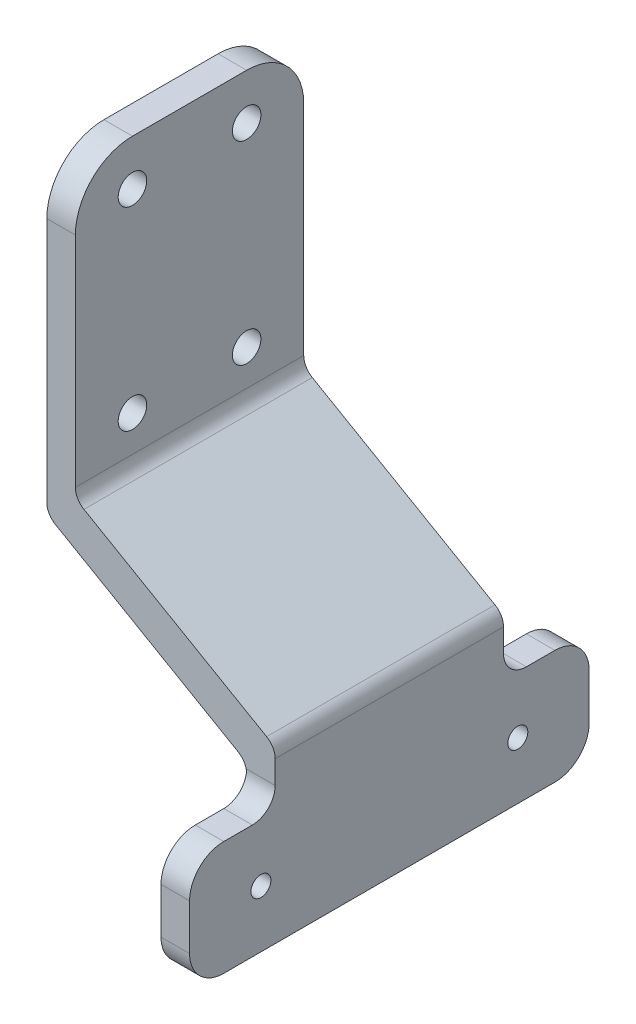
ISO-10303-21;
HEADER;
FILE_DESCRIPTION(('STEP AP214'),'2;1');
FILE_NAME('part.step','',(''),(''),'','','');
FILE_SCHEMA(('AUTOMOTIVE_DESIGN { 1 0 10303 214 1 1 1 1 }'));
ENDSEC;
DATA;
#1=APPLICATION_CONTEXT('core data for automotive mechanical design processes');
#2=APPLICATION_PROTOCOL_DEFINITION('international standard','automotive_design',2000,#1);
#3=PRODUCT_CONTEXT('',#1,'mechanical');
#4=PRODUCT('Part','Part','',(#3));
#5=PRODUCT_RELATED_PRODUCT_CATEGORY('part','',(#4));
#6=PRODUCT_DEFINITION_FORMATION('','',#4);
#7=PRODUCT_DEFINITION_CONTEXT('part definition',#1,'design');
#8=PRODUCT_DEFINITION('design','',#6,#7);
#9=PRODUCT_DEFINITION_SHAPE('','',#8);
#10=(LENGTH_UNIT() NAMED_UNIT(*) SI_UNIT(.MILLI.,.METRE.));
#11=(NAMED_UNIT(*) PLANE_ANGLE_UNIT() SI_UNIT($,.RADIAN.));
#12=(NAMED_UNIT(*) SI_UNIT($,.STERADIAN.) SOLID_ANGLE_UNIT());
#13=UNCERTAINTY_MEASURE_WITH_UNIT(LENGTH_MEASURE(1.E-05),#10,'distance_accuracy_value','');
#14=(GEOMETRIC_REPRESENTATION_CONTEXT(3) GLOBAL_UNCERTAINTY_ASSIGNED_CONTEXT((#13)) GLOBAL_UNIT_ASSIGNED_CONTEXT((#10,
#11,#12)) REPRESENTATION_CONTEXT('',''));
#15=CARTESIAN_POINT('',(0.,0.,0.));
#16=DIRECTION('',(0.,0.,1.));
#17=DIRECTION('',(1.,0.,0.));
#18=AXIS2_PLACEMENT_3D('',#15,#16,#17);
#19=CARTESIAN_POINT('',(0.,0.,20.));
#20=DIRECTION('',(0.,0.,-1.));
#21=DIRECTION('',(-1.,0.,0.));
#22=AXIS2_PLACEMENT_3D('',#19,#20,#21);
#23=PLANE('',#22);
#24=DIRECTION('',(0.,-1.,0.));
#25=VECTOR('',#24,1.);
#26=CARTESIAN_POINT('',(35.,0.,20.));
#27=LINE('',#26,#25);
#28=CARTESIAN_POINT('',(35.,3.0606897707942,20.));
#29=VERTEX_POINT('',#28);
#30=CARTESIAN_POINT('',(35.,-1.,20.));
#31=VERTEX_POINT('',#30);
#32=EDGE_CURVE('E586',#29,#31,#27,.T.);
#33=ORIENTED_EDGE('',*,*,#32,.F.);
#34=CARTESIAN_POINT('',(32.,3.0606897707942,20.));
#35=DIRECTION('',(0.,0.,-1.));
#36=DIRECTION('',(-1.,0.,0.));
#37=AXIS2_PLACEMENT_3D('',#34,#35,#36);
#38=CIRCLE('',#37,3.);
#39=CARTESIAN_POINT('',(33.5,5.65876598214752,20.));
#40=VERTEX_POINT('',#39);
#41=EDGE_CURVE('E383',#29,#40,#38,.F.);
#42=ORIENTED_EDGE('',*,*,#41,.T.);
#43=DIRECTION('',(-0.866025403784438,0.500000000000001,0.));
#44=VECTOR('',#43,1.);
#45=CARTESIAN_POINT('',(35.,4.79274057836308,20.));
#46=LINE('',#45,#44);
#47=CARTESIAN_POINT('',(1.49999999999999,24.1339745962156,20.));
#48=VERTEX_POINT('',#47);
#49=EDGE_CURVE('E341',#40,#48,#46,.T.);
#50=ORIENTED_EDGE('',*,*,#49,.T.);
#51=CARTESIAN_POINT('',(3.,26.7320508075689,20.));
#52=DIRECTION('',(0.,0.,-1.));
#53=DIRECTION('',(-1.,0.,0.));
#54=AXIS2_PLACEMENT_3D('',#51,#52,#53);
#55=CIRCLE('',#54,3.);
#56=CARTESIAN_POINT('',(0.,26.7320508075689,20.));
#57=VERTEX_POINT('',#56);
#58=EDGE_CURVE('E11',#48,#57,#55,.T.);
#59=ORIENTED_EDGE('',*,*,#58,.T.);
#60=DIRECTION('',(0.,1.,0.));
#61=VECTOR('',#60,1.);
#62=CARTESIAN_POINT('',(0.,0.,20.));
#63=LINE('',#62,#61);
#64=CARTESIAN_POINT('',(0.,65.,20.));
#65=VERTEX_POINT('',#64);
#66=EDGE_CURVE('E230',#57,#65,#63,.T.);
#67=ORIENTED_EDGE('',*,*,#66,.T.);
#68=DIRECTION('',(1.,0.,0.));
#69=VECTOR('',#68,1.);
#70=CARTESIAN_POINT('',(-5.,65.,20.));
#71=LINE('',#70,#69);
#72=CARTESIAN_POINT('',(-5.,65.,20.));
#73=VERTEX_POINT('',#72);
#74=EDGE_CURVE('E252',#65,#73,#71,.F.);
#75=ORIENTED_EDGE('',*,*,#74,.T.);
#76=DIRECTION('',(0.,1.,0.));
#77=VECTOR('',#76,1.);
#78=CARTESIAN_POINT('',(-5.,0.,20.));
#79=LINE('',#78,#77);
#80=CARTESIAN_POINT('',(-5.,21.9393102292058,20.));
#81=VERTEX_POINT('',#80);
#82=EDGE_CURVE('E575',#81,#73,#79,.T.);
#83=ORIENTED_EDGE('',*,*,#82,.F.);
#84=CARTESIAN_POINT('',(-2.,21.9393102292058,20.));
#85=DIRECTION('',(0.,0.,-1.));
#86=DIRECTION('',(-1.,0.,0.));
#87=AXIS2_PLACEMENT_3D('',#84,#85,#86);
#88=CIRCLE('',#87,3.);
#89=CARTESIAN_POINT('',(-3.5,19.3412340178525,20.));
#90=VERTEX_POINT('',#89);
#91=EDGE_CURVE('E380',#81,#90,#88,.F.);
#92=ORIENTED_EDGE('',*,*,#91,.T.);
#93=DIRECTION('',(0.866025403784438,-0.500000000000001,0.));
#94=VECTOR('',#93,1.);
#95=CARTESIAN_POINT('',(-5.,20.2072594216369,20.));
#96=LINE('',#95,#94);
#97=CARTESIAN_POINT('',(28.5,0.866025403784429,20.));
#98=VERTEX_POINT('',#97);
#99=EDGE_CURVE('E345',#90,#98,#96,.T.);
#100=ORIENTED_EDGE('',*,*,#99,.T.);
#101=CARTESIAN_POINT('',(27.,-1.73205080756888,20.));
#102=DIRECTION('',(0.,0.,-1.));
#103=DIRECTION('',(-1.,0.,0.));
#104=AXIS2_PLACEMENT_3D('',#101,#102,#103);
#105=CIRCLE('',#104,3.);
#106=CARTESIAN_POINT('',(29.9093129111764,-1.,20.));
#107=VERTEX_POINT('',#106);
#108=EDGE_CURVE('E428',#98,#107,#105,.T.);
#109=ORIENTED_EDGE('',*,*,#108,.T.);
#110=DIRECTION('',(-1.,0.,0.));
#111=VECTOR('',#110,1.);
#112=CARTESIAN_POINT('',(0.,-1.,20.));
#113=LINE('',#112,#111);
#114=EDGE_CURVE('E58',#107,#31,#113,.F.);
#115=ORIENTED_EDGE('',*,*,#114,.T.);
#116=EDGE_LOOP('',(#33,#42,#50,#59,#67,#75,#83,#92,#100,#109,#115));
#117=FACE_BOUND('',#116,.T.);
#118=ADVANCED_FACE('F42',(#117),#23,.F.);
#119=CARTESIAN_POINT('',(0.,0.,-20.));
#120=DIRECTION('',(0.,0.,-1.));
#121=DIRECTION('',(-1.,0.,0.));
#122=AXIS2_PLACEMENT_3D('',#119,#120,#121);
#123=PLANE('',#122);
#124=DIRECTION('',(0.866025403784438,-0.500000000000001,0.));
#125=VECTOR('',#124,1.);
#126=CARTESIAN_POINT('',(10.8253175473055,18.75,-20.));
#127=LINE('',#126,#125);
#128=CARTESIAN_POINT('',(1.5,24.1339745962156,-20.));
#129=VERTEX_POINT('',#128);
#130=CARTESIAN_POINT('',(33.5,5.65876598214752,-20.));
#131=VERTEX_POINT('',#130);
#132=EDGE_CURVE('E349',#129,#131,#127,.T.);
#133=ORIENTED_EDGE('',*,*,#132,.T.);
#134=CARTESIAN_POINT('',(32.,3.0606897707942,-20.));
#135=DIRECTION('',(0.,0.,-1.));
#136=DIRECTION('',(-1.,0.,0.));
#137=AXIS2_PLACEMENT_3D('',#134,#135,#136);
#138=CIRCLE('',#137,3.);
#139=CARTESIAN_POINT('',(35.,3.0606897707942,-20.));
#140=VERTEX_POINT('',#139);
#141=EDGE_CURVE('E389',#131,#140,#138,.T.);
#142=ORIENTED_EDGE('',*,*,#141,.T.);
#143=DIRECTION('',(0.,1.,0.));
#144=VECTOR('',#143,1.);
#145=CARTESIAN_POINT('',(35.,0.,-20.));
#146=LINE('',#145,#144);
#147=CARTESIAN_POINT('',(35.,-1.,-20.));
#148=VERTEX_POINT('',#147);
#149=EDGE_CURVE('E238',#148,#140,#146,.T.);
#150=ORIENTED_EDGE('',*,*,#149,.F.);
#151=DIRECTION('',(-1.,0.,0.));
#152=VECTOR('',#151,1.);
#153=CARTESIAN_POINT('',(30.,-1.,-20.));
#154=LINE('',#153,#152);
#155=CARTESIAN_POINT('',(29.9093129111764,-1.,-20.));
#156=VERTEX_POINT('',#155);
#157=EDGE_CURVE('E66',#148,#156,#154,.T.);
#158=ORIENTED_EDGE('',*,*,#157,.T.);
#159=CARTESIAN_POINT('',(27.,-1.73205080756888,-20.));
#160=DIRECTION('',(0.,0.,-1.));
#161=DIRECTION('',(-1.,0.,0.));
#162=AXIS2_PLACEMENT_3D('',#159,#160,#161);
#163=CIRCLE('',#162,3.);
#164=CARTESIAN_POINT('',(28.5,0.866025403784431,-20.));
#165=VERTEX_POINT('',#164);
#166=EDGE_CURVE('E405',#156,#165,#163,.F.);
#167=ORIENTED_EDGE('',*,*,#166,.T.);
#168=DIRECTION('',(-0.866025403784438,0.500000000000001,0.));
#169=VECTOR('',#168,1.);
#170=CARTESIAN_POINT('',(7.50000000000001,12.9903810567666,-20.));
#171=LINE('',#170,#169);
#172=CARTESIAN_POINT('',(-3.5,19.3412340178525,-20.));
#173=VERTEX_POINT('',#172);
#174=EDGE_CURVE('E353',#165,#173,#171,.T.);
#175=ORIENTED_EDGE('',*,*,#174,.T.);
#176=CARTESIAN_POINT('',(-2.,21.9393102292058,-20.));
#177=DIRECTION('',(0.,0.,-1.));
#178=DIRECTION('',(-1.,0.,0.));
#179=AXIS2_PLACEMENT_3D('',#176,#177,#178);
#180=CIRCLE('',#179,3.);
#181=CARTESIAN_POINT('',(-5.,21.9393102292058,-20.));
#182=VERTEX_POINT('',#181);
#183=EDGE_CURVE('E386',#173,#182,#180,.T.);
#184=ORIENTED_EDGE('',*,*,#183,.T.);
#185=DIRECTION('',(0.,1.,0.));
#186=VECTOR('',#185,1.);
#187=CARTESIAN_POINT('',(-5.,0.,-20.));
#188=LINE('',#187,#186);
#189=CARTESIAN_POINT('',(-5.,65.,-20.));
#190=VERTEX_POINT('',#189);
#191=EDGE_CURVE('E578',#182,#190,#188,.T.);
#192=ORIENTED_EDGE('',*,*,#191,.T.);
#193=DIRECTION('',(1.,0.,0.));
#194=VECTOR('',#193,1.);
#195=CARTESIAN_POINT('',(0.,65.,-20.));
#196=LINE('',#195,#194);
#197=CARTESIAN_POINT('',(0.,65.,-20.));
#198=VERTEX_POINT('',#197);
#199=EDGE_CURVE('E261',#190,#198,#196,.T.);
#200=ORIENTED_EDGE('',*,*,#199,.T.);
#201=DIRECTION('',(0.,1.,0.));
#202=VECTOR('',#201,1.);
#203=CARTESIAN_POINT('',(0.,0.,-20.));
#204=LINE('',#203,#202);
#205=CARTESIAN_POINT('',(0.,26.7320508075689,-20.));
#206=VERTEX_POINT('',#205);
#207=EDGE_CURVE('E213',#206,#198,#204,.T.);
#208=ORIENTED_EDGE('',*,*,#207,.F.);
#209=CARTESIAN_POINT('',(3.,26.7320508075689,-20.));
#210=DIRECTION('',(0.,0.,-1.));
#211=DIRECTION('',(-1.,0.,0.));
#212=AXIS2_PLACEMENT_3D('',#209,#210,#211);
#213=CIRCLE('',#212,3.);
#214=EDGE_CURVE('E51',#206,#129,#213,.F.);
#215=ORIENTED_EDGE('',*,*,#214,.T.);
#216=EDGE_LOOP('',(#133,#142,#150,#158,#167,#175,#184,#192,#200,#208,#215));
#217=FACE_BOUND('',#216,.T.);
#218=ADVANCED_FACE('F456',(#217),#123,.T.);
#219=CARTESIAN_POINT('',(30.,0.,0.));
#220=DIRECTION('',(1.,0.,0.));
#221=DIRECTION('',(0.,0.,-1.));
#222=AXIS2_PLACEMENT_3D('',#219,#220,#221);
#223=PLANE('',#222);
#224=CARTESIAN_POINT('',(30.,-15.,22.5));
#225=DIRECTION('',(1.,0.,0.));
#226=DIRECTION('',(0.,0.,-1.));
#227=AXIS2_PLACEMENT_3D('',#224,#225,#226);
#228=CIRCLE('',#227,1.75);
#229=CARTESIAN_POINT('',(30.,-15.,20.75));
#230=VERTEX_POINT('',#229);
#231=EDGE_CURVE('E231',#230,#230,#228,.T.);
#232=ORIENTED_EDGE('',*,*,#231,.T.);
#233=EDGE_LOOP('',(#232));
#234=FACE_BOUND('',#233,.T.);
#235=CARTESIAN_POINT('',(30.,-15.,-22.5));
#236=DIRECTION('',(1.,0.,0.));
#237=DIRECTION('',(0.,0.,-1.));
#238=AXIS2_PLACEMENT_3D('',#235,#236,#237);
#239=CIRCLE('',#238,1.75);
#240=CARTESIAN_POINT('',(30.,-15.,-24.25));
#241=VERTEX_POINT('',#240);
#242=EDGE_CURVE('E562',#241,#241,#239,.T.);
#243=ORIENTED_EDGE('',*,*,#242,.T.);
#244=EDGE_LOOP('',(#243));
#245=FACE_BOUND('',#244,.T.);
#246=CARTESIAN_POINT('',(30.,-1.,24.));
#247=DIRECTION('',(1.,0.,0.));
#248=DIRECTION('',(0.,0.,-1.));
#249=AXIS2_PLACEMENT_3D('',#246,#247,#248);
#250=CIRCLE('',#249,4.);
#251=CARTESIAN_POINT('',(30.,-5.,24.));
#252=VERTEX_POINT('',#251);
#253=CARTESIAN_POINT('',(30.,-1.73205080756888,20.0675578052389));
#254=VERTEX_POINT('',#253);
#255=EDGE_CURVE('E328',#252,#254,#250,.T.);
#256=ORIENTED_EDGE('',*,*,#255,.T.);
#257=DIRECTION('',(0.,0.,-1.));
#258=VECTOR('',#257,1.);
#259=CARTESIAN_POINT('',(30.,-1.73205080756888,0.));
#260=LINE('',#259,#258);
#261=CARTESIAN_POINT('',(30.,-1.73205080756888,-20.0675578052389));
#262=VERTEX_POINT('',#261);
#263=EDGE_CURVE('E357',#254,#262,#260,.T.);
#264=ORIENTED_EDGE('',*,*,#263,.T.);
#265=CARTESIAN_POINT('',(30.,-1.,-24.));
#266=DIRECTION('',(1.,0.,0.));
#267=DIRECTION('',(0.,0.,-1.));
#268=AXIS2_PLACEMENT_3D('',#265,#266,#267);
#269=CIRCLE('',#268,4.);
#270=CARTESIAN_POINT('',(30.,-5.,-24.));
#271=VERTEX_POINT('',#270);
#272=EDGE_CURVE('E335',#262,#271,#269,.T.);
#273=ORIENTED_EDGE('',*,*,#272,.T.);
#274=DIRECTION('',(0.,0.,-1.));
#275=VECTOR('',#274,1.);
#276=CARTESIAN_POINT('',(30.,-5.,0.));
#277=LINE('',#276,#275);
#278=CARTESIAN_POINT('',(30.,-5.,-29.));
#279=VERTEX_POINT('',#278);
#280=EDGE_CURVE('E590',#271,#279,#277,.T.);
#281=ORIENTED_EDGE('',*,*,#280,.T.);
#282=CARTESIAN_POINT('',(30.,-11.,-29.));
#283=DIRECTION('',(1.,0.,0.));
#284=DIRECTION('',(0.,0.,-1.));
#285=AXIS2_PLACEMENT_3D('',#282,#283,#284);
#286=CIRCLE('',#285,6.);
#287=CARTESIAN_POINT('',(30.,-11.,-35.));
#288=VERTEX_POINT('',#287);
#289=EDGE_CURVE('E277',#279,#288,#286,.F.);
#290=ORIENTED_EDGE('',*,*,#289,.T.);
#291=DIRECTION('',(0.,1.,0.));
#292=VECTOR('',#291,1.);
#293=CARTESIAN_POINT('',(30.,0.,-35.));
#294=LINE('',#293,#292);
#295=CARTESIAN_POINT('',(30.,-19.,-35.));
#296=VERTEX_POINT('',#295);
#297=EDGE_CURVE('E247',#296,#288,#294,.T.);
#298=ORIENTED_EDGE('',*,*,#297,.F.);
#299=CARTESIAN_POINT('',(30.,-19.,-29.));
#300=DIRECTION('',(1.,0.,0.));
#301=DIRECTION('',(0.,0.,-1.));
#302=AXIS2_PLACEMENT_3D('',#299,#300,#301);
#303=CIRCLE('',#302,6.);
#304=CARTESIAN_POINT('',(30.,-25.,-29.));
#305=VERTEX_POINT('',#304);
#306=EDGE_CURVE('E274',#296,#305,#303,.F.);
#307=ORIENTED_EDGE('',*,*,#306,.T.);
#308=DIRECTION('',(0.,0.,-1.));
#309=VECTOR('',#308,1.);
#310=CARTESIAN_POINT('',(30.,-25.,0.));
#311=LINE('',#310,#309);
#312=CARTESIAN_POINT('',(30.,-25.,29.));
#313=VERTEX_POINT('',#312);
#314=EDGE_CURVE('E612',#313,#305,#311,.T.);
#315=ORIENTED_EDGE('',*,*,#314,.F.);
#316=CARTESIAN_POINT('',(30.,-19.,29.));
#317=DIRECTION('',(1.,0.,0.));
#318=DIRECTION('',(0.,0.,-1.));
#319=AXIS2_PLACEMENT_3D('',#316,#317,#318);
#320=CIRCLE('',#319,6.);
#321=CARTESIAN_POINT('',(30.,-19.,35.));
#322=VERTEX_POINT('',#321);
#323=EDGE_CURVE('E271',#313,#322,#320,.F.);
#324=ORIENTED_EDGE('',*,*,#323,.T.);
#325=DIRECTION('',(0.,1.,0.));
#326=VECTOR('',#325,1.);
#327=CARTESIAN_POINT('',(30.,0.,35.));
#328=LINE('',#327,#326);
#329=CARTESIAN_POINT('',(30.,-11.,35.));
#330=VERTEX_POINT('',#329);
#331=EDGE_CURVE('E609',#322,#330,#328,.T.);
#332=ORIENTED_EDGE('',*,*,#331,.T.);
#333=CARTESIAN_POINT('',(30.,-11.,29.));
#334=DIRECTION('',(1.,0.,0.));
#335=DIRECTION('',(0.,0.,-1.));
#336=AXIS2_PLACEMENT_3D('',#333,#334,#335);
#337=CIRCLE('',#336,6.);
#338=CARTESIAN_POINT('',(30.,-5.,29.));
#339=VERTEX_POINT('',#338);
#340=EDGE_CURVE('E268',#330,#339,#337,.F.);
#341=ORIENTED_EDGE('',*,*,#340,.T.);
#342=EDGE_CURVE('E580',#339,#252,#277,.T.);
#343=ORIENTED_EDGE('',*,*,#342,.T.);
#344=EDGE_LOOP('',(#256,#264,#273,#281,#290,#298,#307,#315,#324,#332,#341,#343));
#345=FACE_BOUND('',#344,.T.);
#346=ADVANCED_FACE('F459',(#234,#245,#345),#223,.F.);
#347=CARTESIAN_POINT('',(35.,-5.,0.));
#348=DIRECTION('',(0.,1.,0.));
#349=DIRECTION('',(0.,0.,1.));
#350=AXIS2_PLACEMENT_3D('',#347,#348,#349);
#351=PLANE('',#350);
#352=DIRECTION('',(0.,0.,-1.));
#353=VECTOR('',#352,1.);
#354=CARTESIAN_POINT('',(35.,-5.,0.));
#355=LINE('',#354,#353);
#356=CARTESIAN_POINT('',(35.,-5.,29.));
#357=VERTEX_POINT('',#356);
#358=CARTESIAN_POINT('',(35.,-5.,24.));
#359=VERTEX_POINT('',#358);
#360=EDGE_CURVE('E589',#357,#359,#355,.T.);
#361=ORIENTED_EDGE('',*,*,#360,.T.);
#362=DIRECTION('',(-1.,0.,0.));
#363=VECTOR('',#362,1.);
#364=CARTESIAN_POINT('',(35.,-5.,24.));
#365=LINE('',#364,#363);
#366=EDGE_CURVE('E317',#359,#252,#365,.T.);
#367=ORIENTED_EDGE('',*,*,#366,.T.);
#368=ORIENTED_EDGE('',*,*,#342,.F.);
#369=DIRECTION('',(-1.,0.,0.));
#370=VECTOR('',#369,1.);
#371=CARTESIAN_POINT('',(35.,-5.,29.));
#372=LINE('',#371,#370);
#373=EDGE_CURVE('E314',#339,#357,#372,.F.);
#374=ORIENTED_EDGE('',*,*,#373,.T.);
#375=EDGE_LOOP('',(#361,#367,#368,#374));
#376=FACE_BOUND('',#375,.T.);
#377=ADVANCED_FACE('F467',(#376),#351,.T.);
#378=CARTESIAN_POINT('',(35.,0.,35.));
#379=DIRECTION('',(0.,0.,1.));
#380=DIRECTION('',(0.,-1.,0.));
#381=AXIS2_PLACEMENT_3D('',#378,#379,#380);
#382=PLANE('',#381);
#383=ORIENTED_EDGE('',*,*,#331,.F.);
#384=DIRECTION('',(-1.,0.,0.));
#385=VECTOR('',#384,1.);
#386=CARTESIAN_POINT('',(35.,-19.,35.));
#387=LINE('',#386,#385);
#388=CARTESIAN_POINT('',(35.,-19.,35.));
#389=VERTEX_POINT('',#388);
#390=EDGE_CURVE('E311',#322,#389,#387,.F.);
#391=ORIENTED_EDGE('',*,*,#390,.T.);
#392=DIRECTION('',(0.,1.,0.));
#393=VECTOR('',#392,1.);
#394=CARTESIAN_POINT('',(35.,0.,35.));
#395=LINE('',#394,#393);
#396=CARTESIAN_POINT('',(35.,-11.,35.));
#397=VERTEX_POINT('',#396);
#398=EDGE_CURVE('E594',#389,#397,#395,.T.);
#399=ORIENTED_EDGE('',*,*,#398,.T.);
#400=DIRECTION('',(-1.,0.,0.));
#401=VECTOR('',#400,1.);
#402=CARTESIAN_POINT('',(35.,-11.,35.));
#403=LINE('',#402,#401);
#404=EDGE_CURVE('E307',#397,#330,#403,.T.);
#405=ORIENTED_EDGE('',*,*,#404,.T.);
#406=EDGE_LOOP('',(#383,#391,#399,#405));
#407=FACE_BOUND('',#406,.T.);
#408=ADVANCED_FACE('F463',(#407),#382,.T.);
#409=CARTESIAN_POINT('',(35.,-25.,0.));
#410=DIRECTION('',(0.,1.,0.));
#411=DIRECTION('',(0.,0.,1.));
#412=AXIS2_PLACEMENT_3D('',#409,#410,#411);
#413=PLANE('',#412);
#414=ORIENTED_EDGE('',*,*,#314,.T.);
#415=DIRECTION('',(-1.,0.,0.));
#416=VECTOR('',#415,1.);
#417=CARTESIAN_POINT('',(35.,-25.,-29.));
#418=LINE('',#417,#416);
#419=CARTESIAN_POINT('',(35.,-25.,-29.));
#420=VERTEX_POINT('',#419);
#421=EDGE_CURVE('E304',#305,#420,#418,.F.);
#422=ORIENTED_EDGE('',*,*,#421,.T.);
#423=DIRECTION('',(0.,0.,-1.));
#424=VECTOR('',#423,1.);
#425=CARTESIAN_POINT('',(35.,-25.,0.));
#426=LINE('',#425,#424);
#427=CARTESIAN_POINT('',(35.,-25.,29.));
#428=VERTEX_POINT('',#427);
#429=EDGE_CURVE('E598',#428,#420,#426,.T.);
#430=ORIENTED_EDGE('',*,*,#429,.F.);
#431=DIRECTION('',(-1.,0.,0.));
#432=VECTOR('',#431,1.);
#433=CARTESIAN_POINT('',(30.,-25.,29.));
#434=LINE('',#433,#432);
#435=EDGE_CURVE('E300',#428,#313,#434,.T.);
#436=ORIENTED_EDGE('',*,*,#435,.T.);
#437=EDGE_LOOP('',(#414,#422,#430,#436));
#438=FACE_BOUND('',#437,.T.);
#439=ADVANCED_FACE('F466',(#438),#413,.F.);
#440=CARTESIAN_POINT('',(35.,0.,-35.));
#441=DIRECTION('',(0.,0.,1.));
#442=DIRECTION('',(1.,0.,0.));
#443=AXIS2_PLACEMENT_3D('',#440,#441,#442);
#444=PLANE('',#443);
#445=ORIENTED_EDGE('',*,*,#297,.T.);
#446=DIRECTION('',(-1.,0.,0.));
#447=VECTOR('',#446,1.);
#448=CARTESIAN_POINT('',(35.,-11.,-35.));
#449=LINE('',#448,#447);
#450=CARTESIAN_POINT('',(35.,-11.,-35.));
#451=VERTEX_POINT('',#450);
#452=EDGE_CURVE('E284',#288,#451,#449,.F.);
#453=ORIENTED_EDGE('',*,*,#452,.T.);
#454=DIRECTION('',(0.,1.,0.));
#455=VECTOR('',#454,1.);
#456=CARTESIAN_POINT('',(35.,0.,-35.));
#457=LINE('',#456,#455);
#458=CARTESIAN_POINT('',(35.,-19.,-35.));
#459=VERTEX_POINT('',#458);
#460=EDGE_CURVE('E602',#459,#451,#457,.T.);
#461=ORIENTED_EDGE('',*,*,#460,.F.);
#462=DIRECTION('',(-1.,0.,0.));
#463=VECTOR('',#462,1.);
#464=CARTESIAN_POINT('',(35.,-19.,-35.));
#465=LINE('',#464,#463);
#466=EDGE_CURVE('E280',#459,#296,#465,.T.);
#467=ORIENTED_EDGE('',*,*,#466,.T.);
#468=EDGE_LOOP('',(#445,#453,#461,#467));
#469=FACE_BOUND('',#468,.T.);
#470=ADVANCED_FACE('F471',(#469),#444,.F.);
#471=ORIENTED_EDGE('',*,*,#280,.F.);
#472=DIRECTION('',(-1.,0.,0.));
#473=VECTOR('',#472,1.);
#474=CARTESIAN_POINT('',(35.,-5.,-24.));
#475=LINE('',#474,#473);
#476=CARTESIAN_POINT('',(35.,-5.,-24.));
#477=VERTEX_POINT('',#476);
#478=EDGE_CURVE('E325',#271,#477,#475,.F.);
#479=ORIENTED_EDGE('',*,*,#478,.T.);
#480=CARTESIAN_POINT('',(35.,-5.,-29.));
#481=VERTEX_POINT('',#480);
#482=EDGE_CURVE('E244',#477,#481,#355,.T.);
#483=ORIENTED_EDGE('',*,*,#482,.T.);
#484=DIRECTION('',(-1.,0.,0.));
#485=VECTOR('',#484,1.);
#486=CARTESIAN_POINT('',(30.,-5.,-29.));
#487=LINE('',#486,#485);
#488=EDGE_CURVE('E264',#481,#279,#487,.T.);
#489=ORIENTED_EDGE('',*,*,#488,.T.);
#490=EDGE_LOOP('',(#471,#479,#483,#489));
#491=FACE_BOUND('',#490,.T.);
#492=ADVANCED_FACE('F475',(#491),#351,.T.);
#493=CARTESIAN_POINT('',(35.,0.,0.));
#494=DIRECTION('',(1.,0.,0.));
#495=DIRECTION('',(0.,0.,-1.));
#496=AXIS2_PLACEMENT_3D('',#493,#494,#495);
#497=PLANE('',#496);
#498=CARTESIAN_POINT('',(35.,-15.,22.5));
#499=DIRECTION('',(1.,0.,0.));
#500=DIRECTION('',(0.,0.,-1.));
#501=AXIS2_PLACEMENT_3D('',#498,#499,#500);
#502=CIRCLE('',#501,1.75);
#503=CARTESIAN_POINT('',(35.,-15.,20.75));
#504=VERTEX_POINT('',#503);
#505=EDGE_CURVE('E558',#504,#504,#502,.T.);
#506=ORIENTED_EDGE('',*,*,#505,.F.);
#507=EDGE_LOOP('',(#506));
#508=FACE_BOUND('',#507,.T.);
#509=CARTESIAN_POINT('',(35.,-15.,-22.5));
#510=DIRECTION('',(1.,0.,0.));
#511=DIRECTION('',(0.,0.,-1.));
#512=AXIS2_PLACEMENT_3D('',#509,#510,#511);
#513=CIRCLE('',#512,1.75);
#514=CARTESIAN_POINT('',(35.,-15.,-24.25));
#515=VERTEX_POINT('',#514);
#516=EDGE_CURVE('E554',#515,#515,#513,.T.);
#517=ORIENTED_EDGE('',*,*,#516,.F.);
#518=EDGE_LOOP('',(#517));
#519=FACE_BOUND('',#518,.T.);
#520=ORIENTED_EDGE('',*,*,#149,.T.);
#521=DIRECTION('',(0.,0.,1.));
#522=VECTOR('',#521,1.);
#523=CARTESIAN_POINT('',(35.,3.0606897707942,0.));
#524=LINE('',#523,#522);
#525=EDGE_CURVE('E376',#140,#29,#524,.T.);
#526=ORIENTED_EDGE('',*,*,#525,.T.);
#527=ORIENTED_EDGE('',*,*,#32,.T.);
#528=CARTESIAN_POINT('',(35.,-1.,24.));
#529=DIRECTION('',(1.,0.,0.));
#530=DIRECTION('',(0.,0.,-1.));
#531=AXIS2_PLACEMENT_3D('',#528,#529,#530);
#532=CIRCLE('',#531,4.);
#533=EDGE_CURVE('E332',#31,#359,#532,.F.);
#534=ORIENTED_EDGE('',*,*,#533,.T.);
#535=ORIENTED_EDGE('',*,*,#360,.F.);
#536=CARTESIAN_POINT('',(35.,-11.,29.));
#537=DIRECTION('',(1.,0.,0.));
#538=DIRECTION('',(0.,0.,-1.));
#539=AXIS2_PLACEMENT_3D('',#536,#537,#538);
#540=CIRCLE('',#539,6.);
#541=EDGE_CURVE('E287',#357,#397,#540,.T.);
#542=ORIENTED_EDGE('',*,*,#541,.T.);
#543=ORIENTED_EDGE('',*,*,#398,.F.);
#544=CARTESIAN_POINT('',(35.,-19.,29.));
#545=DIRECTION('',(1.,0.,0.));
#546=DIRECTION('',(0.,0.,-1.));
#547=AXIS2_PLACEMENT_3D('',#544,#545,#546);
#548=CIRCLE('',#547,6.);
#549=EDGE_CURVE('E290',#389,#428,#548,.T.);
#550=ORIENTED_EDGE('',*,*,#549,.T.);
#551=ORIENTED_EDGE('',*,*,#429,.T.);
#552=CARTESIAN_POINT('',(35.,-19.,-29.));
#553=DIRECTION('',(1.,0.,0.));
#554=DIRECTION('',(0.,0.,-1.));
#555=AXIS2_PLACEMENT_3D('',#552,#553,#554);
#556=CIRCLE('',#555,6.);
#557=EDGE_CURVE('E293',#420,#459,#556,.T.);
#558=ORIENTED_EDGE('',*,*,#557,.T.);
#559=ORIENTED_EDGE('',*,*,#460,.T.);
#560=CARTESIAN_POINT('',(35.,-11.,-29.));
#561=DIRECTION('',(1.,0.,0.));
#562=DIRECTION('',(0.,0.,-1.));
#563=AXIS2_PLACEMENT_3D('',#560,#561,#562);
#564=CIRCLE('',#563,6.);
#565=EDGE_CURVE('E296',#451,#481,#564,.T.);
#566=ORIENTED_EDGE('',*,*,#565,.T.);
#567=ORIENTED_EDGE('',*,*,#482,.F.);
#568=CARTESIAN_POINT('',(35.,-1.,-24.));
#569=DIRECTION('',(1.,0.,0.));
#570=DIRECTION('',(0.,0.,-1.));
#571=AXIS2_PLACEMENT_3D('',#568,#569,#570);
#572=CIRCLE('',#571,4.);
#573=EDGE_CURVE('E338',#477,#148,#572,.F.);
#574=ORIENTED_EDGE('',*,*,#573,.T.);
#575=EDGE_LOOP('',(#520,#526,#527,#534,#535,#542,#543,#550,#551,#558,#559,#566,#567,#574));
#576=FACE_BOUND('',#575,.T.);
#577=ADVANCED_FACE('F479',(#508,#519,#576),#497,.T.);
#578=CARTESIAN_POINT('',(0.,0.,0.));
#579=DIRECTION('',(-1.,0.,0.));
#580=DIRECTION('',(0.,0.,1.));
#581=AXIS2_PLACEMENT_3D('',#578,#579,#580);
#582=PLANE('',#581);
#583=CARTESIAN_POINT('',(0.,67.,-10.));
#584=DIRECTION('',(1.,0.,0.));
#585=DIRECTION('',(0.,0.,1.));
#586=AXIS2_PLACEMENT_3D('',#583,#584,#585);
#587=CIRCLE('',#586,2.5);
#588=CARTESIAN_POINT('',(0.,67.,-7.5));
#589=VERTEX_POINT('',#588);
#590=EDGE_CURVE('E546',#589,#589,#587,.T.);
#591=ORIENTED_EDGE('',*,*,#590,.F.);
#592=EDGE_LOOP('',(#591));
#593=FACE_BOUND('',#592,.T.);
#594=CARTESIAN_POINT('',(0.,33.,-10.));
#595=DIRECTION('',(1.,0.,0.));
#596=DIRECTION('',(0.,0.,1.));
#597=AXIS2_PLACEMENT_3D('',#594,#595,#596);
#598=CIRCLE('',#597,2.5);
#599=CARTESIAN_POINT('',(0.,33.,-7.5));
#600=VERTEX_POINT('',#599);
#601=EDGE_CURVE('E536',#600,#600,#598,.T.);
#602=ORIENTED_EDGE('',*,*,#601,.F.);
#603=EDGE_LOOP('',(#602));
#604=FACE_BOUND('',#603,.T.);
#605=CARTESIAN_POINT('',(0.,33.,10.));
#606=DIRECTION('',(1.,0.,0.));
#607=DIRECTION('',(0.,0.,-1.));
#608=AXIS2_PLACEMENT_3D('',#605,#606,#607);
#609=CIRCLE('',#608,2.5);
#610=CARTESIAN_POINT('',(0.,33.,7.5));
#611=VERTEX_POINT('',#610);
#612=EDGE_CURVE('E526',#611,#611,#609,.T.);
#613=ORIENTED_EDGE('',*,*,#612,.F.);
#614=EDGE_LOOP('',(#613));
#615=FACE_BOUND('',#614,.T.);
#616=CARTESIAN_POINT('',(0.,67.,10.));
#617=DIRECTION('',(1.,0.,0.));
#618=DIRECTION('',(0.,0.,-1.));
#619=AXIS2_PLACEMENT_3D('',#616,#617,#618);
#620=CIRCLE('',#619,2.5);
#621=CARTESIAN_POINT('',(0.,67.,7.5));
#622=VERTEX_POINT('',#621);
#623=EDGE_CURVE('E533',#622,#622,#620,.T.);
#624=ORIENTED_EDGE('',*,*,#623,.F.);
#625=EDGE_LOOP('',(#624));
#626=FACE_BOUND('',#625,.T.);
#627=ORIENTED_EDGE('',*,*,#66,.F.);
#628=DIRECTION('',(0.,0.,-1.));
#629=VECTOR('',#628,1.);
#630=CARTESIAN_POINT('',(0.,26.7320508075689,0.));
#631=LINE('',#630,#629);
#632=EDGE_CURVE('E367',#57,#206,#631,.T.);
#633=ORIENTED_EDGE('',*,*,#632,.T.);
#634=ORIENTED_EDGE('',*,*,#207,.T.);
#635=CARTESIAN_POINT('',(0.,65.,-10.));
#636=DIRECTION('',(-1.,0.,0.));
#637=DIRECTION('',(0.,0.,1.));
#638=AXIS2_PLACEMENT_3D('',#635,#636,#637);
#639=CIRCLE('',#638,10.);
#640=CARTESIAN_POINT('',(0.,75.,-10.));
#641=VERTEX_POINT('',#640);
#642=EDGE_CURVE('E205',#198,#641,#639,.F.);
#643=ORIENTED_EDGE('',*,*,#642,.T.);
#644=DIRECTION('',(0.,0.,1.));
#645=VECTOR('',#644,1.);
#646=CARTESIAN_POINT('',(0.,75.,-20.));
#647=LINE('',#646,#645);
#648=CARTESIAN_POINT('',(0.,75.,10.));
#649=VERTEX_POINT('',#648);
#650=EDGE_CURVE('E210',#641,#649,#647,.T.);
#651=ORIENTED_EDGE('',*,*,#650,.T.);
#652=CARTESIAN_POINT('',(0.,65.,10.));
#653=DIRECTION('',(-1.,0.,0.));
#654=DIRECTION('',(0.,0.,1.));
#655=AXIS2_PLACEMENT_3D('',#652,#653,#654);
#656=CIRCLE('',#655,10.);
#657=EDGE_CURVE('E219',#649,#65,#656,.F.);
#658=ORIENTED_EDGE('',*,*,#657,.T.);
#659=EDGE_LOOP('',(#627,#633,#634,#643,#651,#658));
#660=FACE_BOUND('',#659,.T.);
#661=ADVANCED_FACE('F208',(#593,#604,#615,#626,#660),#582,.F.);
#662=CARTESIAN_POINT('',(-5.,75.,-20.));
#663=DIRECTION('',(0.,1.,0.));
#664=DIRECTION('',(0.,0.,1.));
#665=AXIS2_PLACEMENT_3D('',#662,#663,#664);
#666=PLANE('',#665);
#667=DIRECTION('',(0.,0.,1.));
#668=VECTOR('',#667,1.);
#669=CARTESIAN_POINT('',(-5.,75.,-20.));
#670=LINE('',#669,#668);
#671=CARTESIAN_POINT('',(-5.,75.,-10.));
#672=VERTEX_POINT('',#671);
#673=CARTESIAN_POINT('',(-5.,75.,10.));
#674=VERTEX_POINT('',#673);
#675=EDGE_CURVE('E572',#672,#674,#670,.T.);
#676=ORIENTED_EDGE('',*,*,#675,.T.);
#677=DIRECTION('',(1.,0.,0.));
#678=VECTOR('',#677,1.);
#679=CARTESIAN_POINT('',(0.,75.,10.));
#680=LINE('',#679,#678);
#681=EDGE_CURVE('E220',#674,#649,#680,.T.);
#682=ORIENTED_EDGE('',*,*,#681,.T.);
#683=ORIENTED_EDGE('',*,*,#650,.F.);
#684=DIRECTION('',(1.,0.,0.));
#685=VECTOR('',#684,1.);
#686=CARTESIAN_POINT('',(-5.,75.,-10.));
#687=LINE('',#686,#685);
#688=EDGE_CURVE('E226',#641,#672,#687,.F.);
#689=ORIENTED_EDGE('',*,*,#688,.T.);
#690=EDGE_LOOP('',(#676,#682,#683,#689));
#691=FACE_BOUND('',#690,.T.);
#692=ADVANCED_FACE('F225',(#691),#666,.T.);
#693=CARTESIAN_POINT('',(-5.,0.,0.));
#694=DIRECTION('',(-1.,0.,0.));
#695=DIRECTION('',(0.,0.,1.));
#696=AXIS2_PLACEMENT_3D('',#693,#694,#695);
#697=PLANE('',#696);
#698=CARTESIAN_POINT('',(-5.,67.,-10.));
#699=DIRECTION('',(1.,0.,0.));
#700=DIRECTION('',(0.,0.,1.));
#701=AXIS2_PLACEMENT_3D('',#698,#699,#700);
#702=CIRCLE('',#701,2.5);
#703=CARTESIAN_POINT('',(-5.,67.,-7.5));
#704=VERTEX_POINT('',#703);
#705=EDGE_CURVE('E542',#704,#704,#702,.T.);
#706=ORIENTED_EDGE('',*,*,#705,.T.);
#707=EDGE_LOOP('',(#706));
#708=FACE_BOUND('',#707,.T.);
#709=CARTESIAN_POINT('',(-5.,33.,-10.));
#710=DIRECTION('',(1.,0.,0.));
#711=DIRECTION('',(0.,0.,1.));
#712=AXIS2_PLACEMENT_3D('',#709,#710,#711);
#713=CIRCLE('',#712,2.5);
#714=CARTESIAN_POINT('',(-5.,33.,-7.5));
#715=VERTEX_POINT('',#714);
#716=EDGE_CURVE('E529',#715,#715,#713,.T.);
#717=ORIENTED_EDGE('',*,*,#716,.T.);
#718=EDGE_LOOP('',(#717));
#719=FACE_BOUND('',#718,.T.);
#720=CARTESIAN_POINT('',(-5.,33.,10.));
#721=DIRECTION('',(1.,0.,0.));
#722=DIRECTION('',(0.,0.,-1.));
#723=AXIS2_PLACEMENT_3D('',#720,#721,#722);
#724=CIRCLE('',#723,2.5);
#725=CARTESIAN_POINT('',(-5.,33.,7.5));
#726=VERTEX_POINT('',#725);
#727=EDGE_CURVE('E523',#726,#726,#724,.T.);
#728=ORIENTED_EDGE('',*,*,#727,.T.);
#729=EDGE_LOOP('',(#728));
#730=FACE_BOUND('',#729,.T.);
#731=CARTESIAN_POINT('',(-5.,67.,10.));
#732=DIRECTION('',(1.,0.,0.));
#733=DIRECTION('',(0.,0.,-1.));
#734=AXIS2_PLACEMENT_3D('',#731,#732,#733);
#735=CIRCLE('',#734,2.5);
#736=CARTESIAN_POINT('',(-5.,67.,7.5));
#737=VERTEX_POINT('',#736);
#738=EDGE_CURVE('E550',#737,#737,#735,.T.);
#739=ORIENTED_EDGE('',*,*,#738,.T.);
#740=EDGE_LOOP('',(#739));
#741=FACE_BOUND('',#740,.T.);
#742=ORIENTED_EDGE('',*,*,#191,.F.);
#743=DIRECTION('',(0.,0.,1.));
#744=VECTOR('',#743,1.);
#745=CARTESIAN_POINT('',(-5.,21.9393102292058,0.));
#746=LINE('',#745,#744);
#747=EDGE_CURVE('E392',#182,#81,#746,.T.);
#748=ORIENTED_EDGE('',*,*,#747,.T.);
#749=ORIENTED_EDGE('',*,*,#82,.T.);
#750=CARTESIAN_POINT('',(-5.,65.,10.));
#751=DIRECTION('',(-1.,0.,0.));
#752=DIRECTION('',(0.,0.,1.));
#753=AXIS2_PLACEMENT_3D('',#750,#751,#752);
#754=CIRCLE('',#753,10.);
#755=EDGE_CURVE('E258',#73,#674,#754,.T.);
#756=ORIENTED_EDGE('',*,*,#755,.T.);
#757=ORIENTED_EDGE('',*,*,#675,.F.);
#758=CARTESIAN_POINT('',(-5.,65.,-10.));
#759=DIRECTION('',(-1.,0.,0.));
#760=DIRECTION('',(0.,0.,1.));
#761=AXIS2_PLACEMENT_3D('',#758,#759,#760);
#762=CIRCLE('',#761,10.);
#763=EDGE_CURVE('E236',#672,#190,#762,.T.);
#764=ORIENTED_EDGE('',*,*,#763,.T.);
#765=EDGE_LOOP('',(#742,#748,#749,#756,#757,#764));
#766=FACE_BOUND('',#765,.T.);
#767=ADVANCED_FACE('F489',(#708,#719,#730,#741,#766),#697,.T.);
#768=CARTESIAN_POINT('',(-5.,-15.,-22.5));
#769=DIRECTION('',(1.,0.,0.));
#770=DIRECTION('',(0.,0.,-1.));
#771=AXIS2_PLACEMENT_3D('',#768,#769,#770);
#772=CYLINDRICAL_SURFACE('',#771,1.75);
#773=ORIENTED_EDGE('',*,*,#516,.T.);
#774=EDGE_LOOP('',(#773));
#775=FACE_BOUND('',#774,.T.);
#776=ORIENTED_EDGE('',*,*,#242,.F.);
#777=EDGE_LOOP('',(#776));
#778=FACE_BOUND('',#777,.T.);
#779=ADVANCED_FACE('F495',(#775,#778),#772,.F.);
#780=CARTESIAN_POINT('',(-5.,-15.,22.5));
#781=DIRECTION('',(1.,0.,0.));
#782=DIRECTION('',(0.,0.,-1.));
#783=AXIS2_PLACEMENT_3D('',#780,#781,#782);
#784=CYLINDRICAL_SURFACE('',#783,1.75);
#785=ORIENTED_EDGE('',*,*,#505,.T.);
#786=EDGE_LOOP('',(#785));
#787=FACE_BOUND('',#786,.T.);
#788=ORIENTED_EDGE('',*,*,#231,.F.);
#789=EDGE_LOOP('',(#788));
#790=FACE_BOUND('',#789,.T.);
#791=ADVANCED_FACE('F499',(#787,#790),#784,.F.);
#792=CARTESIAN_POINT('',(-5.,67.,10.));
#793=DIRECTION('',(1.,0.,0.));
#794=DIRECTION('',(0.,0.,-1.));
#795=AXIS2_PLACEMENT_3D('',#792,#793,#794);
#796=CYLINDRICAL_SURFACE('',#795,2.5);
#797=ORIENTED_EDGE('',*,*,#738,.F.);
#798=EDGE_LOOP('',(#797));
#799=FACE_BOUND('',#798,.T.);
#800=ORIENTED_EDGE('',*,*,#623,.T.);
#801=EDGE_LOOP('',(#800));
#802=FACE_BOUND('',#801,.T.);
#803=ADVANCED_FACE('F503',(#799,#802),#796,.F.);
#804=CARTESIAN_POINT('',(-5.,33.,10.));
#805=DIRECTION('',(1.,0.,0.));
#806=DIRECTION('',(0.,0.,-1.));
#807=AXIS2_PLACEMENT_3D('',#804,#805,#806);
#808=CYLINDRICAL_SURFACE('',#807,2.5);
#809=ORIENTED_EDGE('',*,*,#727,.F.);
#810=EDGE_LOOP('',(#809));
#811=FACE_BOUND('',#810,.T.);
#812=ORIENTED_EDGE('',*,*,#612,.T.);
#813=EDGE_LOOP('',(#812));
#814=FACE_BOUND('',#813,.T.);
#815=ADVANCED_FACE('F507',(#811,#814),#808,.F.);
#816=CARTESIAN_POINT('',(-5.,33.,-10.));
#817=DIRECTION('',(1.,0.,0.));
#818=DIRECTION('',(0.,0.,-1.));
#819=AXIS2_PLACEMENT_3D('',#816,#817,#818);
#820=CYLINDRICAL_SURFACE('',#819,2.5);
#821=ORIENTED_EDGE('',*,*,#716,.F.);
#822=EDGE_LOOP('',(#821));
#823=FACE_BOUND('',#822,.T.);
#824=ORIENTED_EDGE('',*,*,#601,.T.);
#825=EDGE_LOOP('',(#824));
#826=FACE_BOUND('',#825,.T.);
#827=ADVANCED_FACE('F511',(#823,#826),#820,.F.);
#828=CARTESIAN_POINT('',(-5.,67.,-10.));
#829=DIRECTION('',(1.,0.,0.));
#830=DIRECTION('',(0.,0.,-1.));
#831=AXIS2_PLACEMENT_3D('',#828,#829,#830);
#832=CYLINDRICAL_SURFACE('',#831,2.5);
#833=ORIENTED_EDGE('',*,*,#705,.F.);
#834=EDGE_LOOP('',(#833));
#835=FACE_BOUND('',#834,.T.);
#836=ORIENTED_EDGE('',*,*,#590,.T.);
#837=EDGE_LOOP('',(#836));
#838=FACE_BOUND('',#837,.T.);
#839=ADVANCED_FACE('F454',(#835,#838),#832,.F.);
#840=CARTESIAN_POINT('',(-5.,65.,10.));
#841=DIRECTION('',(-1.,0.,0.));
#842=DIRECTION('',(0.,0.,1.));
#843=AXIS2_PLACEMENT_3D('',#840,#841,#842);
#844=CYLINDRICAL_SURFACE('',#843,10.);
#845=ORIENTED_EDGE('',*,*,#755,.F.);
#846=ORIENTED_EDGE('',*,*,#74,.F.);
#847=ORIENTED_EDGE('',*,*,#657,.F.);
#848=ORIENTED_EDGE('',*,*,#681,.F.);
#849=EDGE_LOOP('',(#845,#846,#847,#848));
#850=FACE_BOUND('',#849,.T.);
#851=ADVANCED_FACE('F451',(#850),#844,.T.);
#852=CARTESIAN_POINT('',(0.,65.,-10.));
#853=DIRECTION('',(1.,0.,0.));
#854=DIRECTION('',(0.,0.,-1.));
#855=AXIS2_PLACEMENT_3D('',#852,#853,#854);
#856=CYLINDRICAL_SURFACE('',#855,10.);
#857=ORIENTED_EDGE('',*,*,#763,.F.);
#858=ORIENTED_EDGE('',*,*,#688,.F.);
#859=ORIENTED_EDGE('',*,*,#642,.F.);
#860=ORIENTED_EDGE('',*,*,#199,.F.);
#861=EDGE_LOOP('',(#857,#858,#859,#860));
#862=FACE_BOUND('',#861,.T.);
#863=ADVANCED_FACE('F234',(#862),#856,.T.);
#864=CARTESIAN_POINT('',(35.,-11.,-29.));
#865=DIRECTION('',(1.,0.,0.));
#866=DIRECTION('',(0.,0.,-1.));
#867=AXIS2_PLACEMENT_3D('',#864,#865,#866);
#868=CYLINDRICAL_SURFACE('',#867,6.);
#869=ORIENTED_EDGE('',*,*,#565,.F.);
#870=ORIENTED_EDGE('',*,*,#452,.F.);
#871=ORIENTED_EDGE('',*,*,#289,.F.);
#872=ORIENTED_EDGE('',*,*,#488,.F.);
#873=EDGE_LOOP('',(#869,#870,#871,#872));
#874=FACE_BOUND('',#873,.T.);
#875=ADVANCED_FACE('F444',(#874),#868,.T.);
#876=CARTESIAN_POINT('',(35.,-19.,-29.));
#877=DIRECTION('',(-1.,0.,0.));
#878=DIRECTION('',(0.,0.,1.));
#879=AXIS2_PLACEMENT_3D('',#876,#877,#878);
#880=CYLINDRICAL_SURFACE('',#879,6.);
#881=ORIENTED_EDGE('',*,*,#557,.F.);
#882=ORIENTED_EDGE('',*,*,#421,.F.);
#883=ORIENTED_EDGE('',*,*,#306,.F.);
#884=ORIENTED_EDGE('',*,*,#466,.F.);
#885=EDGE_LOOP('',(#881,#882,#883,#884));
#886=FACE_BOUND('',#885,.T.);
#887=ADVANCED_FACE('F440',(#886),#880,.T.);
#888=CARTESIAN_POINT('',(35.,-19.,29.));
#889=DIRECTION('',(1.,0.,0.));
#890=DIRECTION('',(0.,0.,-1.));
#891=AXIS2_PLACEMENT_3D('',#888,#889,#890);
#892=CYLINDRICAL_SURFACE('',#891,6.);
#893=ORIENTED_EDGE('',*,*,#549,.F.);
#894=ORIENTED_EDGE('',*,*,#390,.F.);
#895=ORIENTED_EDGE('',*,*,#323,.F.);
#896=ORIENTED_EDGE('',*,*,#435,.F.);
#897=EDGE_LOOP('',(#893,#894,#895,#896));
#898=FACE_BOUND('',#897,.T.);
#899=ADVANCED_FACE('F436',(#898),#892,.T.);
#900=CARTESIAN_POINT('',(35.,-11.,29.));
#901=DIRECTION('',(-1.,0.,0.));
#902=DIRECTION('',(0.,0.,1.));
#903=AXIS2_PLACEMENT_3D('',#900,#901,#902);
#904=CYLINDRICAL_SURFACE('',#903,6.);
#905=ORIENTED_EDGE('',*,*,#541,.F.);
#906=ORIENTED_EDGE('',*,*,#373,.F.);
#907=ORIENTED_EDGE('',*,*,#340,.F.);
#908=ORIENTED_EDGE('',*,*,#404,.F.);
#909=EDGE_LOOP('',(#905,#906,#907,#908));
#910=FACE_BOUND('',#909,.T.);
#911=ADVANCED_FACE('F433',(#910),#904,.T.);
#912=CARTESIAN_POINT('',(35.,-1.,24.));
#913=DIRECTION('',(-1.,0.,0.));
#914=DIRECTION('',(0.,0.,1.));
#915=AXIS2_PLACEMENT_3D('',#912,#913,#914);
#916=CYLINDRICAL_SURFACE('',#915,4.);
#917=ORIENTED_EDGE('',*,*,#533,.F.);
#918=ORIENTED_EDGE('',*,*,#114,.F.);
#919=CARTESIAN_POINT('',(29.9093129111764,-1.,20.));
#920=CARTESIAN_POINT('',(29.9244869159742,-1.06027163396315,19.9999918984314));
#921=CARTESIAN_POINT('',(29.9377729311725,-1.12102085628127,20.0013622844622));
#922=CARTESIAN_POINT('',(29.960468774178,-1.24274214776835,20.0069121950624));
#923=CARTESIAN_POINT('',(29.9699008879825,-1.30371081796816,20.0110751899291));
#924=CARTESIAN_POINT('',(29.984967436551,-1.42585472762082,20.0222608837659));
#925=CARTESIAN_POINT('',(29.9906018709827,-1.48702996709174,20.0292835829862));
#926=CARTESIAN_POINT('',(29.9981332739346,-1.60957792794628,20.0462321148572));
#927=CARTESIAN_POINT('',(30.0000079876671,-1.67094968391463,20.0561748371726));
#928=CARTESIAN_POINT('',(30.,-1.73205080756888,20.0675578052389));
#929=B_SPLINE_CURVE_WITH_KNOTS('',3,(#919,#920,#921,#922,#923,#924,#925,#926,#927,#928),
.UNSPECIFIED.,.F.,.F.,(4,2,2,2,4),(0.,0.18641504628612,0.371736308663993,0.557057587251872,
0.743472631834596),.UNSPECIFIED.);
#930=EDGE_CURVE('E422',#107,#254,#929,.T.);
#931=ORIENTED_EDGE('',*,*,#930,.T.);
#932=ORIENTED_EDGE('',*,*,#255,.F.);
#933=ORIENTED_EDGE('',*,*,#366,.F.);
#934=EDGE_LOOP('',(#917,#918,#931,#932,#933));
#935=FACE_BOUND('',#934,.T.);
#936=ADVANCED_FACE('F429',(#935),#916,.F.);
#937=CARTESIAN_POINT('',(0.,-1.,-24.));
#938=DIRECTION('',(1.,0.,0.));
#939=DIRECTION('',(0.,0.,-1.));
#940=AXIS2_PLACEMENT_3D('',#937,#938,#939);
#941=CYLINDRICAL_SURFACE('',#940,4.);
#942=ORIENTED_EDGE('',*,*,#573,.F.);
#943=ORIENTED_EDGE('',*,*,#478,.F.);
#944=ORIENTED_EDGE('',*,*,#272,.F.);
#945=CARTESIAN_POINT('',(30.,-1.73205080756888,-20.0675578052389));
#946=CARTESIAN_POINT('',(30.0000079876671,-1.67094968391463,-20.0561748371726));
#947=CARTESIAN_POINT('',(29.9981332739346,-1.60957792794628,-20.0462321148572));
#948=CARTESIAN_POINT('',(29.9906018709827,-1.48702996709173,-20.0292835829862));
#949=CARTESIAN_POINT('',(29.984967436551,-1.42585472762082,-20.0222608837659));
#950=CARTESIAN_POINT('',(29.9699008879825,-1.30371081796816,-20.0110751899291));
#951=CARTESIAN_POINT('',(29.960468774178,-1.24274214776835,-20.0069121950624));
#952=CARTESIAN_POINT('',(29.9377729311725,-1.12102085628127,-20.0013622844622));
#953=CARTESIAN_POINT('',(29.9244869159742,-1.06027163396315,-19.9999918984314));
#954=CARTESIAN_POINT('',(29.9093129111764,-1.,-20.));
#955=B_SPLINE_CURVE_WITH_KNOTS('',3,(#945,#946,#947,#948,#949,#950,#951,#952,#953,#954),
.UNSPECIFIED.,.F.,.F.,(4,2,2,2,4),(0.,0.186415044582725,0.371736323170603,0.557057585548477,
0.743472631834596),.UNSPECIFIED.);
#956=EDGE_CURVE('E396',#262,#156,#955,.T.);
#957=ORIENTED_EDGE('',*,*,#956,.T.);
#958=ORIENTED_EDGE('',*,*,#157,.F.);
#959=EDGE_LOOP('',(#942,#943,#944,#957,#958));
#960=FACE_BOUND('',#959,.T.);
#961=ADVANCED_FACE('F407',(#960),#941,.F.);
#962=CARTESIAN_POINT('',(-5.,20.2072594216369,0.));
#963=DIRECTION('',(-0.5,-0.866025403784438,0.));
#964=DIRECTION('',(0.,0.,-1.));
#965=AXIS2_PLACEMENT_3D('',#962,#963,#964);
#966=PLANE('',#965);
#967=ORIENTED_EDGE('',*,*,#174,.F.);
#968=DIRECTION('',(0.,0.,-1.));
#969=VECTOR('',#968,1.);
#970=CARTESIAN_POINT('',(28.5,0.866025403784432,0.));
#971=LINE('',#970,#969);
#972=EDGE_CURVE('E364',#165,#98,#971,.F.);
#973=ORIENTED_EDGE('',*,*,#972,.T.);
#974=ORIENTED_EDGE('',*,*,#99,.F.);
#975=DIRECTION('',(0.,0.,1.));
#976=VECTOR('',#975,1.);
#977=CARTESIAN_POINT('',(-3.5,19.3412340178525,0.));
#978=LINE('',#977,#976);
#979=EDGE_CURVE('E361',#90,#173,#978,.F.);
#980=ORIENTED_EDGE('',*,*,#979,.T.);
#981=EDGE_LOOP('',(#967,#973,#974,#980));
#982=FACE_BOUND('',#981,.T.);
#983=ADVANCED_FACE('F669',(#982),#966,.T.);
#984=CARTESIAN_POINT('',(35.,4.79274057836308,0.));
#985=DIRECTION('',(0.5,0.866025403784438,0.));
#986=DIRECTION('',(0.,0.,-1.));
#987=AXIS2_PLACEMENT_3D('',#984,#985,#986);
#988=PLANE('',#987);
#989=ORIENTED_EDGE('',*,*,#132,.F.);
#990=DIRECTION('',(0.,0.,-1.));
#991=VECTOR('',#990,1.);
#992=CARTESIAN_POINT('',(1.5,24.1339745962156,0.));
#993=LINE('',#992,#991);
#994=EDGE_CURVE('E373',#129,#48,#993,.F.);
#995=ORIENTED_EDGE('',*,*,#994,.T.);
#996=ORIENTED_EDGE('',*,*,#49,.F.);
#997=DIRECTION('',(0.,0.,1.));
#998=VECTOR('',#997,1.);
#999=CARTESIAN_POINT('',(33.5,5.65876598214752,0.));
#1000=LINE('',#999,#998);
#1001=EDGE_CURVE('E370',#40,#131,#1000,.F.);
#1002=ORIENTED_EDGE('',*,*,#1001,.T.);
#1003=EDGE_LOOP('',(#989,#995,#996,#1002));
#1004=FACE_BOUND('',#1003,.T.);
#1005=ADVANCED_FACE('F417',(#1004),#988,.T.);
#1006=CARTESIAN_POINT('',(27.,-1.73205080756888,0.));
#1007=DIRECTION('',(0.,0.,-1.));
#1008=DIRECTION('',(-1.,0.,0.));
#1009=AXIS2_PLACEMENT_3D('',#1006,#1007,#1008);
#1010=CYLINDRICAL_SURFACE('',#1009,3.);
#1011=ORIENTED_EDGE('',*,*,#108,.F.);
#1012=ORIENTED_EDGE('',*,*,#972,.F.);
#1013=ORIENTED_EDGE('',*,*,#166,.F.);
#1014=ORIENTED_EDGE('',*,*,#956,.F.);
#1015=ORIENTED_EDGE('',*,*,#263,.F.);
#1016=ORIENTED_EDGE('',*,*,#930,.F.);
#1017=EDGE_LOOP('',(#1011,#1012,#1013,#1014,#1015,#1016));
#1018=FACE_BOUND('',#1017,.T.);
#1019=ADVANCED_FACE('F411',(#1018),#1010,.F.);
#1020=CARTESIAN_POINT('',(3.,26.7320508075689,0.));
#1021=DIRECTION('',(0.,0.,-1.));
#1022=DIRECTION('',(-1.,0.,0.));
#1023=AXIS2_PLACEMENT_3D('',#1020,#1021,#1022);
#1024=CYLINDRICAL_SURFACE('',#1023,3.);
#1025=ORIENTED_EDGE('',*,*,#58,.F.);
#1026=ORIENTED_EDGE('',*,*,#994,.F.);
#1027=ORIENTED_EDGE('',*,*,#214,.F.);
#1028=ORIENTED_EDGE('',*,*,#632,.F.);
#1029=EDGE_LOOP('',(#1025,#1026,#1027,#1028));
#1030=FACE_BOUND('',#1029,.T.);
#1031=ADVANCED_FACE('F416',(#1030),#1024,.F.);
#1032=CARTESIAN_POINT('',(32.,3.0606897707942,0.));
#1033=DIRECTION('',(0.,0.,1.));
#1034=DIRECTION('',(1.,0.,0.));
#1035=AXIS2_PLACEMENT_3D('',#1032,#1033,#1034);
#1036=CYLINDRICAL_SURFACE('',#1035,3.);
#1037=ORIENTED_EDGE('',*,*,#141,.F.);
#1038=ORIENTED_EDGE('',*,*,#1001,.F.);
#1039=ORIENTED_EDGE('',*,*,#41,.F.);
#1040=ORIENTED_EDGE('',*,*,#525,.F.);
#1041=EDGE_LOOP('',(#1037,#1038,#1039,#1040));
#1042=FACE_BOUND('',#1041,.T.);
#1043=ADVANCED_FACE('F660',(#1042),#1036,.T.);
#1044=CARTESIAN_POINT('',(-2.,21.9393102292058,0.));
#1045=DIRECTION('',(0.,0.,1.));
#1046=DIRECTION('',(1.,0.,0.));
#1047=AXIS2_PLACEMENT_3D('',#1044,#1045,#1046);
#1048=CYLINDRICAL_SURFACE('',#1047,3.);
#1049=ORIENTED_EDGE('',*,*,#183,.F.);
#1050=ORIENTED_EDGE('',*,*,#979,.F.);
#1051=ORIENTED_EDGE('',*,*,#91,.F.);
#1052=ORIENTED_EDGE('',*,*,#747,.F.);
#1053=EDGE_LOOP('',(#1049,#1050,#1051,#1052));
#1054=FACE_BOUND('',#1053,.T.);
#1055=ADVANCED_FACE('F44',(#1054),#1048,.T.);
#1056=CLOSED_SHELL('',(#118,#218,#346,#377,#408,#439,#470,#492,#577,#661,#692,#767,#779,#791,
#803,#815,#827,#839,#851,#863,#875,#887,#899,#911,#936,#961,#983,#1005,#1019,#1031,#1043,#1055));
#1057=MANIFOLD_SOLID_BREP('B2',#1056);
#1058=ADVANCED_BREP_SHAPE_REPRESENTATION('',(#18,#1057),#14);
#1059=SHAPE_DEFINITION_REPRESENTATION(#9,#1058);
ENDSEC;
END-ISO-10303-21;
